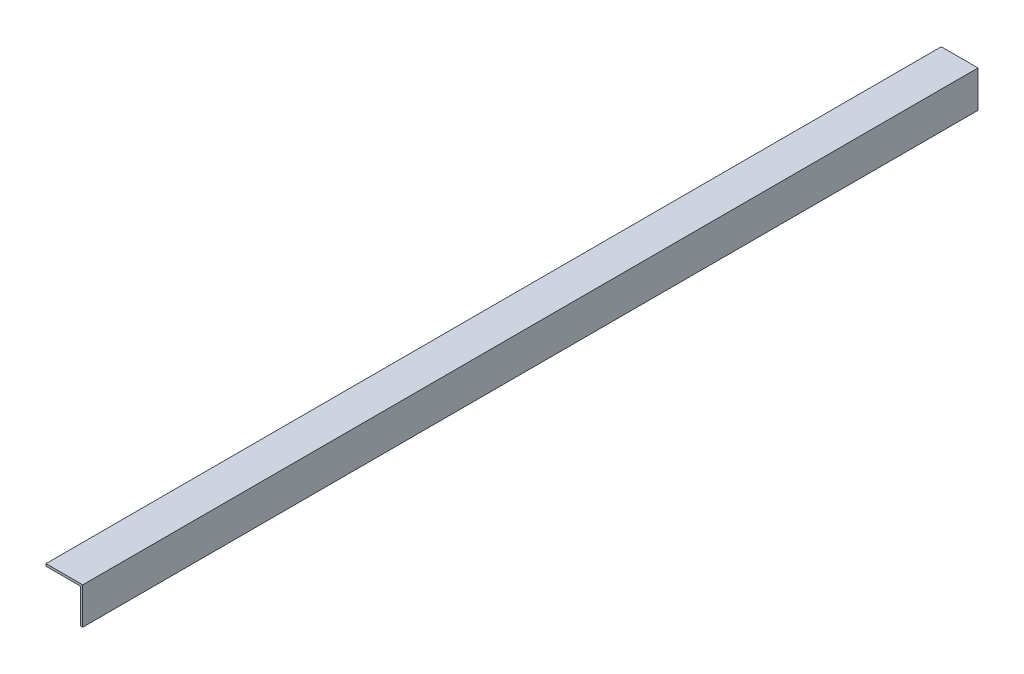
ISO-10303-21;
HEADER;
FILE_DESCRIPTION(('STEP AP214'),'2;1');
FILE_NAME('part.step','',(''),(''),'','','');
FILE_SCHEMA(('AUTOMOTIVE_DESIGN { 1 0 10303 214 1 1 1 1 }'));
ENDSEC;
DATA;
#1=APPLICATION_CONTEXT('core data for automotive mechanical design processes');
#2=APPLICATION_PROTOCOL_DEFINITION('international standard','automotive_design',2000,#1);
#3=PRODUCT_CONTEXT('',#1,'mechanical');
#4=PRODUCT('Part','Part','',(#3));
#5=PRODUCT_RELATED_PRODUCT_CATEGORY('part','',(#4));
#6=PRODUCT_DEFINITION_FORMATION('','',#4);
#7=PRODUCT_DEFINITION_CONTEXT('part definition',#1,'design');
#8=PRODUCT_DEFINITION('design','',#6,#7);
#9=PRODUCT_DEFINITION_SHAPE('','',#8);
#10=(LENGTH_UNIT() NAMED_UNIT(*) SI_UNIT(.MILLI.,.METRE.));
#11=(NAMED_UNIT(*) PLANE_ANGLE_UNIT() SI_UNIT($,.RADIAN.));
#12=(NAMED_UNIT(*) SI_UNIT($,.STERADIAN.) SOLID_ANGLE_UNIT());
#13=UNCERTAINTY_MEASURE_WITH_UNIT(LENGTH_MEASURE(1.E-05),#10,'distance_accuracy_value','');
#14=(GEOMETRIC_REPRESENTATION_CONTEXT(3) GLOBAL_UNCERTAINTY_ASSIGNED_CONTEXT((#13)) GLOBAL_UNIT_ASSIGNED_CONTEXT((#10,
#11,#12)) REPRESENTATION_CONTEXT('',''));
#15=CARTESIAN_POINT('',(0.,0.,0.));
#16=DIRECTION('',(0.,0.,1.));
#17=DIRECTION('',(1.,0.,0.));
#18=AXIS2_PLACEMENT_3D('',#15,#16,#17);
#19=CARTESIAN_POINT('',(662.,1154.,-800.));
#20=DIRECTION('',(1.,0.,0.));
#21=DIRECTION('',(0.,0.,-1.));
#22=AXIS2_PLACEMENT_3D('',#19,#20,#21);
#23=PLANE('',#22);
#24=DIRECTION('',(0.,1.,0.));
#25=VECTOR('',#24,1.);
#26=CARTESIAN_POINT('',(662.,1154.,-20.));
#27=LINE('',#26,#25);
#28=CARTESIAN_POINT('',(662.,1122.,-20.));
#29=VERTEX_POINT('',#28);
#30=CARTESIAN_POINT('',(662.,1154.,-20.));
#31=VERTEX_POINT('',#30);
#32=EDGE_CURVE('E124',#29,#31,#27,.T.);
#33=ORIENTED_EDGE('',*,*,#32,.F.);
#34=DIRECTION('',(0.,0.,1.));
#35=VECTOR('',#34,1.);
#36=CARTESIAN_POINT('',(662.,1122.,-800.));
#37=LINE('',#36,#35);
#38=CARTESIAN_POINT('',(662.,1122.,-800.));
#39=VERTEX_POINT('',#38);
#40=EDGE_CURVE('E11',#39,#29,#37,.T.);
#41=ORIENTED_EDGE('',*,*,#40,.F.);
#42=DIRECTION('',(0.,1.,0.));
#43=VECTOR('',#42,1.);
#44=CARTESIAN_POINT('',(662.,1154.,-800.));
#45=LINE('',#44,#43);
#46=CARTESIAN_POINT('',(662.,1154.,-800.));
#47=VERTEX_POINT('',#46);
#48=EDGE_CURVE('E138',#39,#47,#45,.T.);
#49=ORIENTED_EDGE('',*,*,#48,.T.);
#50=DIRECTION('',(0.,0.,1.));
#51=VECTOR('',#50,1.);
#52=CARTESIAN_POINT('',(662.,1154.,-800.));
#53=LINE('',#52,#51);
#54=EDGE_CURVE('E42',#47,#31,#53,.T.);
#55=ORIENTED_EDGE('',*,*,#54,.T.);
#56=EDGE_LOOP('',(#33,#41,#49,#55));
#57=FACE_BOUND('',#56,.T.);
#58=ADVANCED_FACE('F39',(#57),#23,.T.);
#59=CARTESIAN_POINT('',(662.,1122.,-800.));
#60=DIRECTION('',(0.,-1.,0.));
#61=DIRECTION('',(0.,0.,-1.));
#62=AXIS2_PLACEMENT_3D('',#59,#60,#61);
#63=PLANE('',#62);
#64=DIRECTION('',(1.,0.,0.));
#65=VECTOR('',#64,1.);
#66=CARTESIAN_POINT('',(662.,1122.,-20.));
#67=LINE('',#66,#65);
#68=CARTESIAN_POINT('',(660.,1122.,-20.));
#69=VERTEX_POINT('',#68);
#70=EDGE_CURVE('E136',#69,#29,#67,.T.);
#71=ORIENTED_EDGE('',*,*,#70,.F.);
#72=DIRECTION('',(0.,0.,1.));
#73=VECTOR('',#72,1.);
#74=CARTESIAN_POINT('',(660.,1122.,-800.));
#75=LINE('',#74,#73);
#76=CARTESIAN_POINT('',(660.,1122.,-800.));
#77=VERTEX_POINT('',#76);
#78=EDGE_CURVE('E48',#77,#69,#75,.T.);
#79=ORIENTED_EDGE('',*,*,#78,.F.);
#80=DIRECTION('',(1.,0.,0.));
#81=VECTOR('',#80,1.);
#82=CARTESIAN_POINT('',(662.,1122.,-800.));
#83=LINE('',#82,#81);
#84=EDGE_CURVE('E114',#77,#39,#83,.T.);
#85=ORIENTED_EDGE('',*,*,#84,.T.);
#86=ORIENTED_EDGE('',*,*,#40,.T.);
#87=EDGE_LOOP('',(#71,#79,#85,#86));
#88=FACE_BOUND('',#87,.T.);
#89=ADVANCED_FACE('F146',(#88),#63,.T.);
#90=CARTESIAN_POINT('',(660.,1122.,-800.));
#91=DIRECTION('',(-1.,0.,0.));
#92=DIRECTION('',(0.,0.,1.));
#93=AXIS2_PLACEMENT_3D('',#90,#91,#92);
#94=PLANE('',#93);
#95=DIRECTION('',(0.,-1.,0.));
#96=VECTOR('',#95,1.);
#97=CARTESIAN_POINT('',(660.,1122.,-20.));
#98=LINE('',#97,#96);
#99=CARTESIAN_POINT('',(660.,1152.,-20.));
#100=VERTEX_POINT('',#99);
#101=EDGE_CURVE('E101',#100,#69,#98,.T.);
#102=ORIENTED_EDGE('',*,*,#101,.F.);
#103=DIRECTION('',(0.,0.,1.));
#104=VECTOR('',#103,1.);
#105=CARTESIAN_POINT('',(660.,1152.,-800.));
#106=LINE('',#105,#104);
#107=CARTESIAN_POINT('',(660.,1152.,-800.));
#108=VERTEX_POINT('',#107);
#109=EDGE_CURVE('E96',#108,#100,#106,.T.);
#110=ORIENTED_EDGE('',*,*,#109,.F.);
#111=DIRECTION('',(0.,-1.,0.));
#112=VECTOR('',#111,1.);
#113=CARTESIAN_POINT('',(660.,1122.,-800.));
#114=LINE('',#113,#112);
#115=EDGE_CURVE('E99',#108,#77,#114,.T.);
#116=ORIENTED_EDGE('',*,*,#115,.T.);
#117=ORIENTED_EDGE('',*,*,#78,.T.);
#118=EDGE_LOOP('',(#102,#110,#116,#117));
#119=FACE_BOUND('',#118,.T.);
#120=ADVANCED_FACE('F98',(#119),#94,.T.);
#121=CARTESIAN_POINT('',(660.,1152.,-800.));
#122=DIRECTION('',(0.,-1.,0.));
#123=DIRECTION('',(0.,0.,-1.));
#124=AXIS2_PLACEMENT_3D('',#121,#122,#123);
#125=PLANE('',#124);
#126=DIRECTION('',(1.,0.,0.));
#127=VECTOR('',#126,1.);
#128=CARTESIAN_POINT('',(660.,1152.,-20.));
#129=LINE('',#128,#127);
#130=CARTESIAN_POINT('',(630.,1152.,-20.));
#131=VERTEX_POINT('',#130);
#132=EDGE_CURVE('E133',#131,#100,#129,.T.);
#133=ORIENTED_EDGE('',*,*,#132,.F.);
#134=DIRECTION('',(0.,0.,1.));
#135=VECTOR('',#134,1.);
#136=CARTESIAN_POINT('',(630.,1152.,-800.));
#137=LINE('',#136,#135);
#138=CARTESIAN_POINT('',(630.,1152.,-800.));
#139=VERTEX_POINT('',#138);
#140=EDGE_CURVE('E106',#139,#131,#137,.T.);
#141=ORIENTED_EDGE('',*,*,#140,.F.);
#142=DIRECTION('',(1.,0.,0.));
#143=VECTOR('',#142,1.);
#144=CARTESIAN_POINT('',(660.,1152.,-800.));
#145=LINE('',#144,#143);
#146=EDGE_CURVE('E112',#139,#108,#145,.T.);
#147=ORIENTED_EDGE('',*,*,#146,.T.);
#148=ORIENTED_EDGE('',*,*,#109,.T.);
#149=EDGE_LOOP('',(#133,#141,#147,#148));
#150=FACE_BOUND('',#149,.T.);
#151=ADVANCED_FACE('F116',(#150),#125,.T.);
#152=CARTESIAN_POINT('',(630.,1152.,-800.));
#153=DIRECTION('',(-1.,0.,0.));
#154=DIRECTION('',(0.,0.,1.));
#155=AXIS2_PLACEMENT_3D('',#152,#153,#154);
#156=PLANE('',#155);
#157=DIRECTION('',(0.,-1.,0.));
#158=VECTOR('',#157,1.);
#159=CARTESIAN_POINT('',(630.,1152.,-20.));
#160=LINE('',#159,#158);
#161=CARTESIAN_POINT('',(630.,1154.,-20.));
#162=VERTEX_POINT('',#161);
#163=EDGE_CURVE('E130',#162,#131,#160,.T.);
#164=ORIENTED_EDGE('',*,*,#163,.F.);
#165=DIRECTION('',(0.,0.,1.));
#166=VECTOR('',#165,1.);
#167=CARTESIAN_POINT('',(630.,1154.,-800.));
#168=LINE('',#167,#166);
#169=CARTESIAN_POINT('',(630.,1154.,-800.));
#170=VERTEX_POINT('',#169);
#171=EDGE_CURVE('E141',#170,#162,#168,.T.);
#172=ORIENTED_EDGE('',*,*,#171,.F.);
#173=DIRECTION('',(0.,-1.,0.));
#174=VECTOR('',#173,1.);
#175=CARTESIAN_POINT('',(630.,1152.,-800.));
#176=LINE('',#175,#174);
#177=EDGE_CURVE('E117',#170,#139,#176,.T.);
#178=ORIENTED_EDGE('',*,*,#177,.T.);
#179=ORIENTED_EDGE('',*,*,#140,.T.);
#180=EDGE_LOOP('',(#164,#172,#178,#179));
#181=FACE_BOUND('',#180,.T.);
#182=ADVANCED_FACE('F159',(#181),#156,.T.);
#183=CARTESIAN_POINT('',(630.,1154.,-800.));
#184=DIRECTION('',(0.,1.,0.));
#185=DIRECTION('',(0.,0.,1.));
#186=AXIS2_PLACEMENT_3D('',#183,#184,#185);
#187=PLANE('',#186);
#188=DIRECTION('',(-1.,0.,0.));
#189=VECTOR('',#188,1.);
#190=CARTESIAN_POINT('',(630.,1154.,-20.));
#191=LINE('',#190,#189);
#192=EDGE_CURVE('E127',#31,#162,#191,.T.);
#193=ORIENTED_EDGE('',*,*,#192,.F.);
#194=ORIENTED_EDGE('',*,*,#54,.F.);
#195=DIRECTION('',(-1.,0.,0.));
#196=VECTOR('',#195,1.);
#197=CARTESIAN_POINT('',(630.,1154.,-800.));
#198=LINE('',#197,#196);
#199=EDGE_CURVE('E119',#47,#170,#198,.T.);
#200=ORIENTED_EDGE('',*,*,#199,.T.);
#201=ORIENTED_EDGE('',*,*,#171,.T.);
#202=EDGE_LOOP('',(#193,#194,#200,#201));
#203=FACE_BOUND('',#202,.T.);
#204=ADVANCED_FACE('F143',(#203),#187,.T.);
#205=CARTESIAN_POINT('',(0.,0.,-800.));
#206=DIRECTION('',(0.,0.,-1.));
#207=DIRECTION('',(-1.,0.,0.));
#208=AXIS2_PLACEMENT_3D('',#205,#206,#207);
#209=PLANE('',#208);
#210=ORIENTED_EDGE('',*,*,#48,.F.);
#211=ORIENTED_EDGE('',*,*,#84,.F.);
#212=ORIENTED_EDGE('',*,*,#115,.F.);
#213=ORIENTED_EDGE('',*,*,#146,.F.);
#214=ORIENTED_EDGE('',*,*,#177,.F.);
#215=ORIENTED_EDGE('',*,*,#199,.F.);
#216=EDGE_LOOP('',(#210,#211,#212,#213,#214,#215));
#217=FACE_BOUND('',#216,.T.);
#218=ADVANCED_FACE('F110',(#217),#209,.T.);
#219=CARTESIAN_POINT('',(0.,0.,-20.));
#220=DIRECTION('',(0.,0.,-1.));
#221=DIRECTION('',(-1.,0.,0.));
#222=AXIS2_PLACEMENT_3D('',#219,#220,#221);
#223=PLANE('',#222);
#224=ORIENTED_EDGE('',*,*,#32,.T.);
#225=ORIENTED_EDGE('',*,*,#192,.T.);
#226=ORIENTED_EDGE('',*,*,#163,.T.);
#227=ORIENTED_EDGE('',*,*,#132,.T.);
#228=ORIENTED_EDGE('',*,*,#101,.T.);
#229=ORIENTED_EDGE('',*,*,#70,.T.);
#230=EDGE_LOOP('',(#224,#225,#226,#227,#228,#229));
#231=FACE_BOUND('',#230,.T.);
#232=ADVANCED_FACE('F145',(#231),#223,.F.);
#233=CLOSED_SHELL('',(#58,#89,#120,#151,#182,#204,#218,#232));
#234=MANIFOLD_SOLID_BREP('B2',#233);
#235=ADVANCED_BREP_SHAPE_REPRESENTATION('',(#18,#234),#14);
#236=SHAPE_DEFINITION_REPRESENTATION(#9,#235);
ENDSEC;
END-ISO-10303-21;
